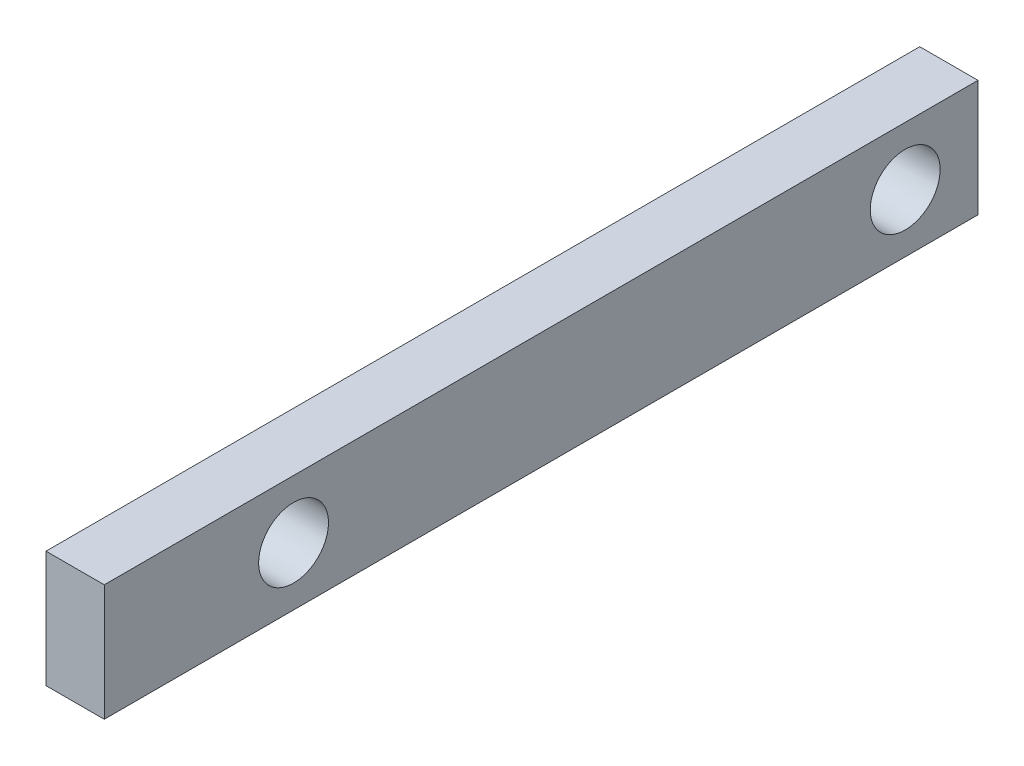
ISO-10303-21;
HEADER;
FILE_DESCRIPTION(('STEP AP214'),'2;1');
FILE_NAME('part.step','',(''),(''),'','','');
FILE_SCHEMA(('AUTOMOTIVE_DESIGN { 1 0 10303 214 1 1 1 1 }'));
ENDSEC;
DATA;
#1=APPLICATION_CONTEXT('core data for automotive mechanical design processes');
#2=APPLICATION_PROTOCOL_DEFINITION('international standard','automotive_design',2000,#1);
#3=PRODUCT_CONTEXT('',#1,'mechanical');
#4=PRODUCT('Part','Part','',(#3));
#5=PRODUCT_RELATED_PRODUCT_CATEGORY('part','',(#4));
#6=PRODUCT_DEFINITION_FORMATION('','',#4);
#7=PRODUCT_DEFINITION_CONTEXT('part definition',#1,'design');
#8=PRODUCT_DEFINITION('design','',#6,#7);
#9=PRODUCT_DEFINITION_SHAPE('','',#8);
#10=(LENGTH_UNIT() NAMED_UNIT(*) SI_UNIT(.MILLI.,.METRE.));
#11=(NAMED_UNIT(*) PLANE_ANGLE_UNIT() SI_UNIT($,.RADIAN.));
#12=(NAMED_UNIT(*) SI_UNIT($,.STERADIAN.) SOLID_ANGLE_UNIT());
#13=UNCERTAINTY_MEASURE_WITH_UNIT(LENGTH_MEASURE(1.E-05),#10,'distance_accuracy_value','');
#14=(GEOMETRIC_REPRESENTATION_CONTEXT(3) GLOBAL_UNCERTAINTY_ASSIGNED_CONTEXT((#13)) GLOBAL_UNIT_ASSIGNED_CONTEXT((#10,
#11,#12)) REPRESENTATION_CONTEXT('',''));
#15=CARTESIAN_POINT('',(0.,0.,0.));
#16=DIRECTION('',(0.,0.,1.));
#17=DIRECTION('',(1.,0.,0.));
#18=AXIS2_PLACEMENT_3D('',#15,#16,#17);
#19=CARTESIAN_POINT('',(2.54,3.27152,32.65424));
#20=DIRECTION('',(0.,0.,-1.));
#21=DIRECTION('',(-1.,0.,0.));
#22=AXIS2_PLACEMENT_3D('',#19,#20,#21);
#23=PLANE('',#22);
#24=DIRECTION('',(0.,-1.,0.));
#25=VECTOR('',#24,1.);
#26=CARTESIAN_POINT('',(0.,3.27152,32.65424));
#27=LINE('',#26,#25);
#28=CARTESIAN_POINT('',(0.,3.27152,32.65424));
#29=VERTEX_POINT('',#28);
#30=CARTESIAN_POINT('',(0.,-1.80848,32.65424));
#31=VERTEX_POINT('',#30);
#32=EDGE_CURVE('E108',#29,#31,#27,.T.);
#33=ORIENTED_EDGE('',*,*,#32,.T.);
#34=DIRECTION('',(-1.,0.,0.));
#35=VECTOR('',#34,1.);
#36=CARTESIAN_POINT('',(2.54,-1.80848,32.65424));
#37=LINE('',#36,#35);
#38=CARTESIAN_POINT('',(2.54,-1.80848,32.65424));
#39=VERTEX_POINT('',#38);
#40=EDGE_CURVE('E13',#39,#31,#37,.T.);
#41=ORIENTED_EDGE('',*,*,#40,.F.);
#42=DIRECTION('',(0.,-1.,0.));
#43=VECTOR('',#42,1.);
#44=CARTESIAN_POINT('',(2.54,3.27152,32.65424));
#45=LINE('',#44,#43);
#46=CARTESIAN_POINT('',(2.54,3.27152,32.65424));
#47=VERTEX_POINT('',#46);
#48=EDGE_CURVE('E96',#47,#39,#45,.T.);
#49=ORIENTED_EDGE('',*,*,#48,.F.);
#50=DIRECTION('',(-1.,0.,0.));
#51=VECTOR('',#50,1.);
#52=CARTESIAN_POINT('',(2.54,3.27152,32.65424));
#53=LINE('',#52,#51);
#54=EDGE_CURVE('E104',#47,#29,#53,.T.);
#55=ORIENTED_EDGE('',*,*,#54,.T.);
#56=EDGE_LOOP('',(#33,#41,#49,#55));
#57=FACE_BOUND('',#56,.T.);
#58=ADVANCED_FACE('F45',(#57),#23,.F.);
#59=CARTESIAN_POINT('',(2.54,-1.80848,32.65424));
#60=DIRECTION('',(0.,1.,0.));
#61=DIRECTION('',(0.,0.,1.));
#62=AXIS2_PLACEMENT_3D('',#59,#60,#61);
#63=PLANE('',#62);
#64=DIRECTION('',(0.,0.,-1.));
#65=VECTOR('',#64,1.);
#66=CARTESIAN_POINT('',(0.,-1.80848,32.65424));
#67=LINE('',#66,#65);
#68=CARTESIAN_POINT('',(0.,-1.80848,-5.44576000000001));
#69=VERTEX_POINT('',#68);
#70=EDGE_CURVE('E100',#31,#69,#67,.T.);
#71=ORIENTED_EDGE('',*,*,#70,.T.);
#72=DIRECTION('',(-1.,0.,0.));
#73=VECTOR('',#72,1.);
#74=CARTESIAN_POINT('',(2.54,-1.80848,-5.44576000000001));
#75=LINE('',#74,#73);
#76=CARTESIAN_POINT('',(2.54,-1.80848,-5.44576000000001));
#77=VERTEX_POINT('',#76);
#78=EDGE_CURVE('E53',#77,#69,#75,.T.);
#79=ORIENTED_EDGE('',*,*,#78,.F.);
#80=DIRECTION('',(0.,0.,-1.));
#81=VECTOR('',#80,1.);
#82=CARTESIAN_POINT('',(2.54,-1.80848,32.65424));
#83=LINE('',#82,#81);
#84=EDGE_CURVE('E91',#39,#77,#83,.T.);
#85=ORIENTED_EDGE('',*,*,#84,.F.);
#86=ORIENTED_EDGE('',*,*,#40,.T.);
#87=EDGE_LOOP('',(#71,#79,#85,#86));
#88=FACE_BOUND('',#87,.T.);
#89=ADVANCED_FACE('F99',(#88),#63,.F.);
#90=CARTESIAN_POINT('',(2.54,3.27152,-5.44576000000001));
#91=DIRECTION('',(0.,0.,1.));
#92=DIRECTION('',(1.,0.,0.));
#93=AXIS2_PLACEMENT_3D('',#90,#91,#92);
#94=PLANE('',#93);
#95=DIRECTION('',(0.,1.,0.));
#96=VECTOR('',#95,1.);
#97=CARTESIAN_POINT('',(0.,3.27152,-5.44576000000001));
#98=LINE('',#97,#96);
#99=CARTESIAN_POINT('',(0.,3.27152,-5.44576000000001));
#100=VERTEX_POINT('',#99);
#101=EDGE_CURVE('E78',#69,#100,#98,.T.);
#102=ORIENTED_EDGE('',*,*,#101,.T.);
#103=DIRECTION('',(-1.,0.,0.));
#104=VECTOR('',#103,1.);
#105=CARTESIAN_POINT('',(2.54,3.27152,-5.44576000000001));
#106=LINE('',#105,#104);
#107=CARTESIAN_POINT('',(2.54,3.27152,-5.44576000000001));
#108=VERTEX_POINT('',#107);
#109=EDGE_CURVE('E101',#108,#100,#106,.T.);
#110=ORIENTED_EDGE('',*,*,#109,.F.);
#111=DIRECTION('',(0.,1.,0.));
#112=VECTOR('',#111,1.);
#113=CARTESIAN_POINT('',(2.54,3.27152,-5.44576000000001));
#114=LINE('',#113,#112);
#115=EDGE_CURVE('E94',#77,#108,#114,.T.);
#116=ORIENTED_EDGE('',*,*,#115,.F.);
#117=ORIENTED_EDGE('',*,*,#78,.T.);
#118=EDGE_LOOP('',(#102,#110,#116,#117));
#119=FACE_BOUND('',#118,.T.);
#120=ADVANCED_FACE('F102',(#119),#94,.F.);
#121=CARTESIAN_POINT('',(2.54,3.27152,32.65424));
#122=DIRECTION('',(0.,-1.,0.));
#123=DIRECTION('',(0.,0.,-1.));
#124=AXIS2_PLACEMENT_3D('',#121,#122,#123);
#125=PLANE('',#124);
#126=DIRECTION('',(0.,0.,1.));
#127=VECTOR('',#126,1.);
#128=CARTESIAN_POINT('',(0.,3.27152,32.65424));
#129=LINE('',#128,#127);
#130=EDGE_CURVE('E84',#100,#29,#129,.T.);
#131=ORIENTED_EDGE('',*,*,#130,.T.);
#132=ORIENTED_EDGE('',*,*,#54,.F.);
#133=DIRECTION('',(0.,0.,1.));
#134=VECTOR('',#133,1.);
#135=CARTESIAN_POINT('',(2.54,3.27152,32.65424));
#136=LINE('',#135,#134);
#137=EDGE_CURVE('E61',#108,#47,#136,.T.);
#138=ORIENTED_EDGE('',*,*,#137,.F.);
#139=ORIENTED_EDGE('',*,*,#109,.T.);
#140=EDGE_LOOP('',(#131,#132,#138,#139));
#141=FACE_BOUND('',#140,.T.);
#142=ADVANCED_FACE('F116',(#141),#125,.F.);
#143=CARTESIAN_POINT('',(2.54,0.,0.));
#144=DIRECTION('',(1.,0.,0.));
#145=DIRECTION('',(0.,0.,-1.));
#146=AXIS2_PLACEMENT_3D('',#143,#144,#145);
#147=PLANE('',#146);
#148=CARTESIAN_POINT('',(2.54,0.731520000000001,24.39924));
#149=DIRECTION('',(-1.,0.,0.));
#150=DIRECTION('',(0.,0.,1.));
#151=AXIS2_PLACEMENT_3D('',#148,#149,#150);
#152=CIRCLE('',#151,1.524);
#153=CARTESIAN_POINT('',(2.54,0.731520000000001,25.92324));
#154=VERTEX_POINT('',#153);
#155=EDGE_CURVE('E111',#154,#154,#152,.T.);
#156=ORIENTED_EDGE('',*,*,#155,.T.);
#157=EDGE_LOOP('',(#156));
#158=FACE_BOUND('',#157,.T.);
#159=CARTESIAN_POINT('',(2.54,0.731520000000002,-2.27076000000001));
#160=DIRECTION('',(-1.,0.,0.));
#161=DIRECTION('',(0.,0.,1.));
#162=AXIS2_PLACEMENT_3D('',#159,#160,#161);
#163=CIRCLE('',#162,1.524);
#164=CARTESIAN_POINT('',(2.54,0.731520000000002,-0.746760000000004));
#165=VERTEX_POINT('',#164);
#166=EDGE_CURVE('E125',#165,#165,#163,.T.);
#167=ORIENTED_EDGE('',*,*,#166,.T.);
#168=EDGE_LOOP('',(#167));
#169=FACE_BOUND('',#168,.T.);
#170=ORIENTED_EDGE('',*,*,#48,.T.);
#171=ORIENTED_EDGE('',*,*,#84,.T.);
#172=ORIENTED_EDGE('',*,*,#115,.T.);
#173=ORIENTED_EDGE('',*,*,#137,.T.);
#174=EDGE_LOOP('',(#170,#171,#172,#173));
#175=FACE_BOUND('',#174,.T.);
#176=ADVANCED_FACE('F92',(#158,#169,#175),#147,.T.);
#177=CARTESIAN_POINT('',(0.,0.,0.));
#178=DIRECTION('',(1.,0.,0.));
#179=DIRECTION('',(0.,0.,-1.));
#180=AXIS2_PLACEMENT_3D('',#177,#178,#179);
#181=PLANE('',#180);
#182=CARTESIAN_POINT('',(0.,0.731520000000001,24.39924));
#183=DIRECTION('',(-1.,0.,0.));
#184=DIRECTION('',(0.,0.,1.));
#185=AXIS2_PLACEMENT_3D('',#182,#183,#184);
#186=CIRCLE('',#185,1.524);
#187=CARTESIAN_POINT('',(0.,0.731520000000001,25.92324));
#188=VERTEX_POINT('',#187);
#189=EDGE_CURVE('E128',#188,#188,#186,.T.);
#190=ORIENTED_EDGE('',*,*,#189,.F.);
#191=EDGE_LOOP('',(#190));
#192=FACE_BOUND('',#191,.T.);
#193=CARTESIAN_POINT('',(0.,0.731520000000002,-2.27076000000001));
#194=DIRECTION('',(-1.,0.,0.));
#195=DIRECTION('',(0.,0.,1.));
#196=AXIS2_PLACEMENT_3D('',#193,#194,#195);
#197=CIRCLE('',#196,1.524);
#198=CARTESIAN_POINT('',(0.,0.731520000000002,-0.746760000000004));
#199=VERTEX_POINT('',#198);
#200=EDGE_CURVE('E122',#199,#199,#197,.T.);
#201=ORIENTED_EDGE('',*,*,#200,.F.);
#202=EDGE_LOOP('',(#201));
#203=FACE_BOUND('',#202,.T.);
#204=ORIENTED_EDGE('',*,*,#32,.F.);
#205=ORIENTED_EDGE('',*,*,#130,.F.);
#206=ORIENTED_EDGE('',*,*,#101,.F.);
#207=ORIENTED_EDGE('',*,*,#70,.F.);
#208=EDGE_LOOP('',(#204,#205,#206,#207));
#209=FACE_BOUND('',#208,.T.);
#210=ADVANCED_FACE('F119',(#192,#203,#209),#181,.F.);
#211=CARTESIAN_POINT('',(2.54,0.731520000000002,-2.27076000000001));
#212=DIRECTION('',(-1.,0.,0.));
#213=DIRECTION('',(0.,0.,1.));
#214=AXIS2_PLACEMENT_3D('',#211,#212,#213);
#215=CYLINDRICAL_SURFACE('',#214,1.524);
#216=ORIENTED_EDGE('',*,*,#166,.F.);
#217=EDGE_LOOP('',(#216));
#218=FACE_BOUND('',#217,.T.);
#219=ORIENTED_EDGE('',*,*,#200,.T.);
#220=EDGE_LOOP('',(#219));
#221=FACE_BOUND('',#220,.T.);
#222=ADVANCED_FACE('F139',(#218,#221),#215,.F.);
#223=CARTESIAN_POINT('',(2.54,0.731520000000001,24.39924));
#224=DIRECTION('',(-1.,0.,0.));
#225=DIRECTION('',(0.,0.,1.));
#226=AXIS2_PLACEMENT_3D('',#223,#224,#225);
#227=CYLINDRICAL_SURFACE('',#226,1.524);
#228=ORIENTED_EDGE('',*,*,#155,.F.);
#229=EDGE_LOOP('',(#228));
#230=FACE_BOUND('',#229,.T.);
#231=ORIENTED_EDGE('',*,*,#189,.T.);
#232=EDGE_LOOP('',(#231));
#233=FACE_BOUND('',#232,.T.);
#234=ADVANCED_FACE('F136',(#230,#233),#227,.F.);
#235=CLOSED_SHELL('',(#58,#89,#120,#142,#176,#210,#222,#234));
#236=MANIFOLD_SOLID_BREP('B2',#235);
#237=ADVANCED_BREP_SHAPE_REPRESENTATION('',(#18,#236),#14);
#238=SHAPE_DEFINITION_REPRESENTATION(#9,#237);
ENDSEC;
END-ISO-10303-21;
